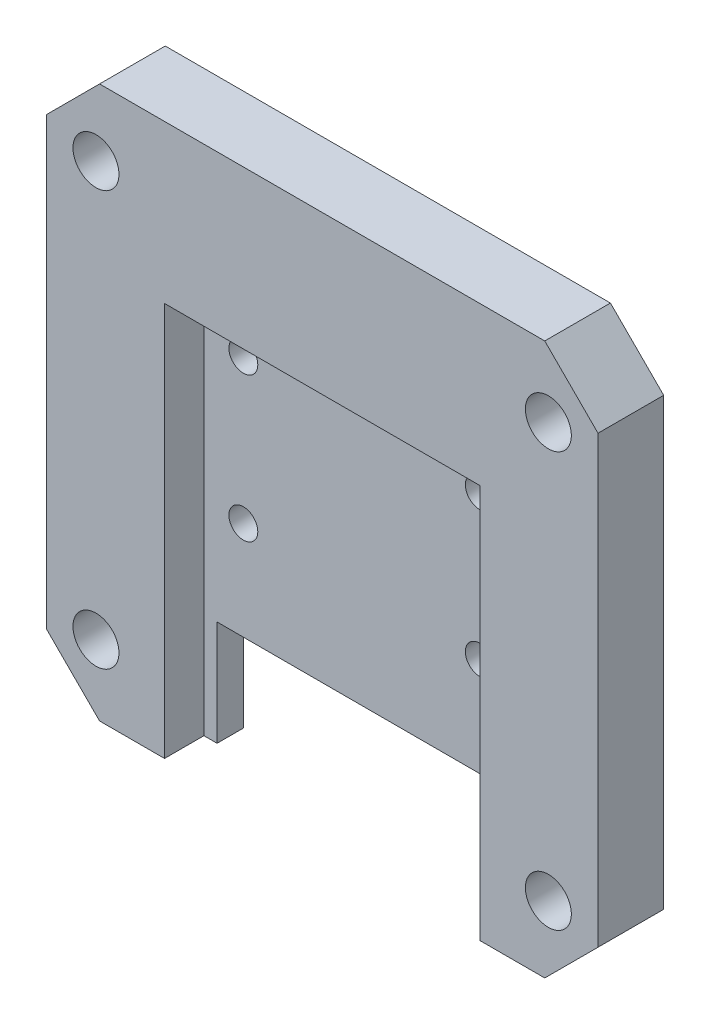
ISO-10303-21;
HEADER;
FILE_DESCRIPTION(('STEP AP214'),'2;1');
FILE_NAME('part.step','',(''),(''),'','','');
FILE_SCHEMA(('AUTOMOTIVE_DESIGN { 1 0 10303 214 1 1 1 1 }'));
ENDSEC;
DATA;
#1=APPLICATION_CONTEXT('core data for automotive mechanical design processes');
#2=APPLICATION_PROTOCOL_DEFINITION('international standard','automotive_design',2000,#1);
#3=PRODUCT_CONTEXT('',#1,'mechanical');
#4=PRODUCT('Part','Part','',(#3));
#5=PRODUCT_RELATED_PRODUCT_CATEGORY('part','',(#4));
#6=PRODUCT_DEFINITION_FORMATION('','',#4);
#7=PRODUCT_DEFINITION_CONTEXT('part definition',#1,'design');
#8=PRODUCT_DEFINITION('design','',#6,#7);
#9=PRODUCT_DEFINITION_SHAPE('','',#8);
#10=(LENGTH_UNIT() NAMED_UNIT(*) SI_UNIT(.MILLI.,.METRE.));
#11=(NAMED_UNIT(*) PLANE_ANGLE_UNIT() SI_UNIT($,.RADIAN.));
#12=(NAMED_UNIT(*) SI_UNIT($,.STERADIAN.) SOLID_ANGLE_UNIT());
#13=UNCERTAINTY_MEASURE_WITH_UNIT(LENGTH_MEASURE(1.E-05),#10,'distance_accuracy_value','');
#14=(GEOMETRIC_REPRESENTATION_CONTEXT(3) GLOBAL_UNCERTAINTY_ASSIGNED_CONTEXT((#13)) GLOBAL_UNIT_ASSIGNED_CONTEXT((#10,
#11,#12)) REPRESENTATION_CONTEXT('',''));
#15=CARTESIAN_POINT('',(0.,0.,0.));
#16=DIRECTION('',(0.,0.,1.));
#17=DIRECTION('',(1.,0.,0.));
#18=AXIS2_PLACEMENT_3D('',#15,#16,#17);
#19=CARTESIAN_POINT('',(4.05500000000004,0.,5.));
#20=DIRECTION('',(0.,1.,0.));
#21=DIRECTION('',(-1.,0.,0.));
#22=AXIS2_PLACEMENT_3D('',#19,#20,#21);
#23=PLANE('',#22);
#24=DIRECTION('',(1.,0.,0.));
#25=VECTOR('',#24,1.);
#26=CARTESIAN_POINT('',(8.99999999999999,0.,2.));
#27=LINE('',#26,#25);
#28=CARTESIAN_POINT('',(8.99999999999999,0.,2.));
#29=VERTEX_POINT('',#28);
#30=CARTESIAN_POINT('',(9.99999999999999,0.,2.));
#31=VERTEX_POINT('',#30);
#32=EDGE_CURVE('E166',#29,#31,#27,.T.);
#33=ORIENTED_EDGE('',*,*,#32,.F.);
#34=DIRECTION('',(0.,0.,1.));
#35=VECTOR('',#34,1.);
#36=CARTESIAN_POINT('',(8.99999999999999,0.,2.));
#37=LINE('',#36,#35);
#38=CARTESIAN_POINT('',(8.99999999999999,0.,5.));
#39=VERTEX_POINT('',#38);
#40=EDGE_CURVE('E152',#29,#39,#37,.T.);
#41=ORIENTED_EDGE('',*,*,#40,.T.);
#42=DIRECTION('',(1.,0.,0.));
#43=VECTOR('',#42,1.);
#44=CARTESIAN_POINT('',(4.05500000000004,0.,5.));
#45=LINE('',#44,#43);
#46=CARTESIAN_POINT('',(4.05500000000004,0.,5.));
#47=VERTEX_POINT('',#46);
#48=EDGE_CURVE('E252',#47,#39,#45,.T.);
#49=ORIENTED_EDGE('',*,*,#48,.F.);
#50=DIRECTION('',(0.,0.,-1.));
#51=VECTOR('',#50,1.);
#52=CARTESIAN_POINT('',(4.05500000000004,0.,5.));
#53=LINE('',#52,#51);
#54=CARTESIAN_POINT('',(4.05500000000004,0.,0.));
#55=VERTEX_POINT('',#54);
#56=EDGE_CURVE('E286',#47,#55,#53,.T.);
#57=ORIENTED_EDGE('',*,*,#56,.T.);
#58=DIRECTION('',(1.,0.,0.));
#59=VECTOR('',#58,1.);
#60=CARTESIAN_POINT('',(4.05500000000004,0.,0.));
#61=LINE('',#60,#59);
#62=CARTESIAN_POINT('',(9.99999999999999,0.,0.));
#63=VERTEX_POINT('',#62);
#64=EDGE_CURVE('E269',#55,#63,#61,.T.);
#65=ORIENTED_EDGE('',*,*,#64,.T.);
#66=DIRECTION('',(0.,0.,1.));
#67=VECTOR('',#66,1.);
#68=CARTESIAN_POINT('',(9.99999999999999,0.,0.));
#69=LINE('',#68,#67);
#70=EDGE_CURVE('E176',#63,#31,#69,.T.);
#71=ORIENTED_EDGE('',*,*,#70,.T.);
#72=EDGE_LOOP('',(#33,#41,#49,#57,#65,#71));
#73=FACE_BOUND('',#72,.T.);
#74=ADVANCED_FACE('F41',(#73),#23,.F.);
#75=CARTESIAN_POINT('',(0.,0.,5.));
#76=DIRECTION('',(0.,0.,1.));
#77=DIRECTION('',(1.,0.,0.));
#78=AXIS2_PLACEMENT_3D('',#75,#76,#77);
#79=PLANE('',#78);
#80=DIRECTION('',(0.,-1.,0.));
#81=VECTOR('',#80,1.);
#82=CARTESIAN_POINT('',(8.99999999999999,0.,5.));
#83=LINE('',#82,#81);
#84=CARTESIAN_POINT('',(8.99999999999999,30.,5.));
#85=VERTEX_POINT('',#84);
#86=EDGE_CURVE('E159',#85,#39,#83,.T.);
#87=ORIENTED_EDGE('',*,*,#86,.F.);
#88=DIRECTION('',(-1.,0.,0.));
#89=VECTOR('',#88,1.);
#90=CARTESIAN_POINT('',(8.99999999999999,30.,5.));
#91=LINE('',#90,#89);
#92=CARTESIAN_POINT('',(33.,30.,5.));
#93=VERTEX_POINT('',#92);
#94=EDGE_CURVE('E174',#93,#85,#91,.T.);
#95=ORIENTED_EDGE('',*,*,#94,.F.);
#96=DIRECTION('',(0.,1.,0.));
#97=VECTOR('',#96,1.);
#98=CARTESIAN_POINT('',(33.,0.,5.));
#99=LINE('',#98,#97);
#100=CARTESIAN_POINT('',(33.,0.,5.));
#101=VERTEX_POINT('',#100);
#102=EDGE_CURVE('E188',#101,#93,#99,.T.);
#103=ORIENTED_EDGE('',*,*,#102,.F.);
#104=CARTESIAN_POINT('',(37.9449999999997,0.,5.));
#105=VERTEX_POINT('',#104);
#106=EDGE_CURVE('E253',#101,#105,#45,.T.);
#107=ORIENTED_EDGE('',*,*,#106,.T.);
#108=DIRECTION('',(0.707106781186596,0.707106781186499,0.));
#109=VECTOR('',#108,1.);
#110=CARTESIAN_POINT('',(42.,4.05499999999975,5.));
#111=LINE('',#110,#109);
#112=CARTESIAN_POINT('',(42.,4.05499999999975,5.));
#113=VERTEX_POINT('',#112);
#114=EDGE_CURVE('E255',#105,#113,#111,.T.);
#115=ORIENTED_EDGE('',*,*,#114,.T.);
#116=DIRECTION('',(0.,1.,0.));
#117=VECTOR('',#116,1.);
#118=CARTESIAN_POINT('',(42.,4.05499999999975,5.));
#119=LINE('',#118,#117);
#120=CARTESIAN_POINT('',(42.,37.9449999999999,5.));
#121=VERTEX_POINT('',#120);
#122=EDGE_CURVE('E258',#113,#121,#119,.T.);
#123=ORIENTED_EDGE('',*,*,#122,.T.);
#124=DIRECTION('',(-0.707106781186536,0.707106781186559,0.));
#125=VECTOR('',#124,1.);
#126=CARTESIAN_POINT('',(37.945,42.,5.));
#127=LINE('',#126,#125);
#128=CARTESIAN_POINT('',(37.945,42.,5.));
#129=VERTEX_POINT('',#128);
#130=EDGE_CURVE('E256',#121,#129,#127,.T.);
#131=ORIENTED_EDGE('',*,*,#130,.T.);
#132=DIRECTION('',(-1.,0.,0.));
#133=VECTOR('',#132,1.);
#134=CARTESIAN_POINT('',(4.05500000000001,42.,5.));
#135=LINE('',#134,#133);
#136=CARTESIAN_POINT('',(4.05500000000001,42.,5.));
#137=VERTEX_POINT('',#136);
#138=EDGE_CURVE('E243',#129,#137,#135,.T.);
#139=ORIENTED_EDGE('',*,*,#138,.T.);
#140=DIRECTION('',(-0.707106781186525,-0.70710678118657,0.));
#141=VECTOR('',#140,1.);
#142=CARTESIAN_POINT('',(4.05500000000001,42.,5.));
#143=LINE('',#142,#141);
#144=CARTESIAN_POINT('',(0.,37.9449999999997,5.));
#145=VERTEX_POINT('',#144);
#146=EDGE_CURVE('E244',#137,#145,#143,.T.);
#147=ORIENTED_EDGE('',*,*,#146,.T.);
#148=DIRECTION('',(0.,-1.,0.));
#149=VECTOR('',#148,1.);
#150=CARTESIAN_POINT('',(0.,4.05499999999973,5.));
#151=LINE('',#150,#149);
#152=CARTESIAN_POINT('',(0.,4.05499999999973,5.));
#153=VERTEX_POINT('',#152);
#154=EDGE_CURVE('E250',#145,#153,#151,.T.);
#155=ORIENTED_EDGE('',*,*,#154,.T.);
#156=DIRECTION('',(0.707106781186574,-0.707106781186521,0.));
#157=VECTOR('',#156,1.);
#158=CARTESIAN_POINT('',(0.,4.05499999999973,5.));
#159=LINE('',#158,#157);
#160=EDGE_CURVE('E247',#153,#47,#159,.T.);
#161=ORIENTED_EDGE('',*,*,#160,.T.);
#162=ORIENTED_EDGE('',*,*,#48,.T.);
#163=EDGE_LOOP('',(#87,#95,#103,#107,#115,#123,#131,#139,#147,#155,#161,#162));
#164=FACE_BOUND('',#163,.T.);
#165=CARTESIAN_POINT('',(38.2202525316936,5.22499999999948,5.));
#166=DIRECTION('',(0.,0.,1.));
#167=DIRECTION('',(-1.,0.,0.));
#168=AXIS2_PLACEMENT_3D('',#165,#166,#167);
#169=CIRCLE('',#168,1.75);
#170=CARTESIAN_POINT('',(36.4702525316936,5.22499999999948,5.));
#171=VERTEX_POINT('',#170);
#172=EDGE_CURVE('E224',#171,#171,#169,.T.);
#173=ORIENTED_EDGE('',*,*,#172,.F.);
#174=EDGE_LOOP('',(#173));
#175=FACE_BOUND('',#174,.T.);
#176=CARTESIAN_POINT('',(3.77974746830582,5.22499999999973,5.));
#177=DIRECTION('',(0.,0.,1.));
#178=DIRECTION('',(1.,0.,0.));
#179=AXIS2_PLACEMENT_3D('',#176,#177,#178);
#180=CIRCLE('',#179,1.75);
#181=CARTESIAN_POINT('',(5.52974746830581,5.22499999999973,5.));
#182=VERTEX_POINT('',#181);
#183=EDGE_CURVE('E234',#182,#182,#180,.T.);
#184=ORIENTED_EDGE('',*,*,#183,.F.);
#185=EDGE_LOOP('',(#184));
#186=FACE_BOUND('',#185,.T.);
#187=CARTESIAN_POINT('',(3.77974746830579,36.7749999999997,5.));
#188=DIRECTION('',(0.,0.,1.));
#189=DIRECTION('',(1.,0.,0.));
#190=AXIS2_PLACEMENT_3D('',#187,#188,#189);
#191=CIRCLE('',#190,1.75);
#192=CARTESIAN_POINT('',(5.52974746830579,36.7749999999997,5.));
#193=VERTEX_POINT('',#192);
#194=EDGE_CURVE('E229',#193,#193,#191,.T.);
#195=ORIENTED_EDGE('',*,*,#194,.F.);
#196=EDGE_LOOP('',(#195));
#197=FACE_BOUND('',#196,.T.);
#198=CARTESIAN_POINT('',(38.2202525316942,36.7749999999995,5.));
#199=DIRECTION('',(0.,0.,1.));
#200=DIRECTION('',(-1.,0.,0.));
#201=AXIS2_PLACEMENT_3D('',#198,#199,#200);
#202=CIRCLE('',#201,1.75);
#203=CARTESIAN_POINT('',(36.4702525316942,36.7749999999995,5.));
#204=VERTEX_POINT('',#203);
#205=EDGE_CURVE('E220',#204,#204,#202,.T.);
#206=ORIENTED_EDGE('',*,*,#205,.F.);
#207=EDGE_LOOP('',(#206));
#208=FACE_BOUND('',#207,.T.);
#209=ADVANCED_FACE('F325',(#164,#175,#186,#197,#208),#79,.T.);
#210=CARTESIAN_POINT('',(0.,0.,0.));
#211=DIRECTION('',(0.,0.,1.));
#212=DIRECTION('',(1.,0.,0.));
#213=AXIS2_PLACEMENT_3D('',#210,#211,#212);
#214=PLANE('',#213);
#215=CARTESIAN_POINT('',(30.,26.5,0.));
#216=DIRECTION('',(0.,0.,1.));
#217=DIRECTION('',(1.,0.,0.));
#218=AXIS2_PLACEMENT_3D('',#215,#216,#217);
#219=CIRCLE('',#218,1.1);
#220=CARTESIAN_POINT('',(31.1,26.5,0.));
#221=VERTEX_POINT('',#220);
#222=EDGE_CURVE('E190',#221,#221,#219,.T.);
#223=ORIENTED_EDGE('',*,*,#222,.T.);
#224=EDGE_LOOP('',(#223));
#225=FACE_BOUND('',#224,.T.);
#226=CARTESIAN_POINT('',(12.,15.5,0.));
#227=DIRECTION('',(0.,0.,1.));
#228=DIRECTION('',(1.,0.,0.));
#229=AXIS2_PLACEMENT_3D('',#226,#227,#228);
#230=CIRCLE('',#229,1.1);
#231=CARTESIAN_POINT('',(13.1,15.5,0.));
#232=VERTEX_POINT('',#231);
#233=EDGE_CURVE('E543',#232,#232,#230,.T.);
#234=ORIENTED_EDGE('',*,*,#233,.T.);
#235=EDGE_LOOP('',(#234));
#236=FACE_BOUND('',#235,.T.);
#237=CARTESIAN_POINT('',(30.,15.5,0.));
#238=DIRECTION('',(0.,0.,1.));
#239=DIRECTION('',(1.,0.,0.));
#240=AXIS2_PLACEMENT_3D('',#237,#238,#239);
#241=CIRCLE('',#240,1.1);
#242=CARTESIAN_POINT('',(31.1,15.5,0.));
#243=VERTEX_POINT('',#242);
#244=EDGE_CURVE('E544',#243,#243,#241,.T.);
#245=ORIENTED_EDGE('',*,*,#244,.T.);
#246=EDGE_LOOP('',(#245));
#247=FACE_BOUND('',#246,.T.);
#248=CARTESIAN_POINT('',(12.,26.5,0.));
#249=DIRECTION('',(0.,0.,1.));
#250=DIRECTION('',(1.,0.,0.));
#251=AXIS2_PLACEMENT_3D('',#248,#249,#250);
#252=CIRCLE('',#251,1.1);
#253=CARTESIAN_POINT('',(13.1,26.5,0.));
#254=VERTEX_POINT('',#253);
#255=EDGE_CURVE('E549',#254,#254,#252,.T.);
#256=ORIENTED_EDGE('',*,*,#255,.T.);
#257=EDGE_LOOP('',(#256));
#258=FACE_BOUND('',#257,.T.);
#259=DIRECTION('',(-1.,0.,0.));
#260=VECTOR('',#259,1.);
#261=CARTESIAN_POINT('',(9.99999999999999,7.99999999999999,0.));
#262=LINE('',#261,#260);
#263=CARTESIAN_POINT('',(32.,7.99999999999999,0.));
#264=VERTEX_POINT('',#263);
#265=CARTESIAN_POINT('',(9.99999999999999,7.99999999999999,0.));
#266=VERTEX_POINT('',#265);
#267=EDGE_CURVE('E204',#264,#266,#262,.T.);
#268=ORIENTED_EDGE('',*,*,#267,.T.);
#269=DIRECTION('',(0.,-1.,0.));
#270=VECTOR('',#269,1.);
#271=CARTESIAN_POINT('',(9.99999999999999,7.99999999999999,0.));
#272=LINE('',#271,#270);
#273=EDGE_CURVE('E199',#266,#63,#272,.T.);
#274=ORIENTED_EDGE('',*,*,#273,.T.);
#275=ORIENTED_EDGE('',*,*,#64,.F.);
#276=DIRECTION('',(0.707106781186574,-0.707106781186521,0.));
#277=VECTOR('',#276,1.);
#278=CARTESIAN_POINT('',(0.,4.05499999999973,0.));
#279=LINE('',#278,#277);
#280=CARTESIAN_POINT('',(0.,4.05499999999973,0.));
#281=VERTEX_POINT('',#280);
#282=EDGE_CURVE('E270',#281,#55,#279,.T.);
#283=ORIENTED_EDGE('',*,*,#282,.F.);
#284=DIRECTION('',(0.,-1.,0.));
#285=VECTOR('',#284,1.);
#286=CARTESIAN_POINT('',(0.,4.05499999999973,0.));
#287=LINE('',#286,#285);
#288=CARTESIAN_POINT('',(0.,37.9449999999997,0.));
#289=VERTEX_POINT('',#288);
#290=EDGE_CURVE('E264',#289,#281,#287,.T.);
#291=ORIENTED_EDGE('',*,*,#290,.F.);
#292=DIRECTION('',(-0.707106781186525,-0.70710678118657,0.));
#293=VECTOR('',#292,1.);
#294=CARTESIAN_POINT('',(4.05500000000001,42.,0.));
#295=LINE('',#294,#293);
#296=CARTESIAN_POINT('',(4.05500000000001,42.,0.));
#297=VERTEX_POINT('',#296);
#298=EDGE_CURVE('E263',#297,#289,#295,.T.);
#299=ORIENTED_EDGE('',*,*,#298,.F.);
#300=DIRECTION('',(-1.,0.,0.));
#301=VECTOR('',#300,1.);
#302=CARTESIAN_POINT('',(4.05500000000001,42.,0.));
#303=LINE('',#302,#301);
#304=CARTESIAN_POINT('',(37.945,42.,0.));
#305=VERTEX_POINT('',#304);
#306=EDGE_CURVE('E236',#305,#297,#303,.T.);
#307=ORIENTED_EDGE('',*,*,#306,.F.);
#308=DIRECTION('',(-0.707106781186536,0.707106781186559,0.));
#309=VECTOR('',#308,1.);
#310=CARTESIAN_POINT('',(37.945,42.,0.));
#311=LINE('',#310,#309);
#312=CARTESIAN_POINT('',(42.,37.9449999999999,0.));
#313=VERTEX_POINT('',#312);
#314=EDGE_CURVE('E242',#313,#305,#311,.T.);
#315=ORIENTED_EDGE('',*,*,#314,.F.);
#316=DIRECTION('',(0.,1.,0.));
#317=VECTOR('',#316,1.);
#318=CARTESIAN_POINT('',(42.,4.05499999999975,0.));
#319=LINE('',#318,#317);
#320=CARTESIAN_POINT('',(42.,4.05499999999975,0.));
#321=VERTEX_POINT('',#320);
#322=EDGE_CURVE('E273',#321,#313,#319,.T.);
#323=ORIENTED_EDGE('',*,*,#322,.F.);
#324=DIRECTION('',(0.707106781186596,0.707106781186499,0.));
#325=VECTOR('',#324,1.);
#326=CARTESIAN_POINT('',(42.,4.05499999999975,0.));
#327=LINE('',#326,#325);
#328=CARTESIAN_POINT('',(37.9449999999997,0.,0.));
#329=VERTEX_POINT('',#328);
#330=EDGE_CURVE('E275',#329,#321,#327,.T.);
#331=ORIENTED_EDGE('',*,*,#330,.F.);
#332=CARTESIAN_POINT('',(32.,0.,0.));
#333=VERTEX_POINT('',#332);
#334=EDGE_CURVE('E267',#333,#329,#61,.T.);
#335=ORIENTED_EDGE('',*,*,#334,.F.);
#336=DIRECTION('',(0.,1.,0.));
#337=VECTOR('',#336,1.);
#338=CARTESIAN_POINT('',(32.,7.99999999999999,0.));
#339=LINE('',#338,#337);
#340=EDGE_CURVE('E61',#333,#264,#339,.T.);
#341=ORIENTED_EDGE('',*,*,#340,.T.);
#342=EDGE_LOOP('',(#268,#274,#275,#283,#291,#299,#307,#315,#323,#331,#335,#341));
#343=FACE_BOUND('',#342,.T.);
#344=CARTESIAN_POINT('',(3.77974746830582,5.22499999999973,0.));
#345=DIRECTION('',(0.,0.,1.));
#346=DIRECTION('',(1.,0.,0.));
#347=AXIS2_PLACEMENT_3D('',#344,#345,#346);
#348=CIRCLE('',#347,1.75);
#349=CARTESIAN_POINT('',(5.52974746830581,5.22499999999973,0.));
#350=VERTEX_POINT('',#349);
#351=EDGE_CURVE('E235',#350,#350,#348,.T.);
#352=ORIENTED_EDGE('',*,*,#351,.T.);
#353=EDGE_LOOP('',(#352));
#354=FACE_BOUND('',#353,.T.);
#355=CARTESIAN_POINT('',(3.77974746830579,36.7749999999997,0.));
#356=DIRECTION('',(0.,0.,1.));
#357=DIRECTION('',(1.,0.,0.));
#358=AXIS2_PLACEMENT_3D('',#355,#356,#357);
#359=CIRCLE('',#358,1.75);
#360=CARTESIAN_POINT('',(5.52974746830579,36.7749999999997,0.));
#361=VERTEX_POINT('',#360);
#362=EDGE_CURVE('E228',#361,#361,#359,.T.);
#363=ORIENTED_EDGE('',*,*,#362,.T.);
#364=EDGE_LOOP('',(#363));
#365=FACE_BOUND('',#364,.T.);
#366=CARTESIAN_POINT('',(38.2202525316936,5.22499999999948,0.));
#367=DIRECTION('',(0.,0.,1.));
#368=DIRECTION('',(-1.,0.,0.));
#369=AXIS2_PLACEMENT_3D('',#366,#367,#368);
#370=CIRCLE('',#369,1.75);
#371=CARTESIAN_POINT('',(36.4702525316936,5.22499999999948,0.));
#372=VERTEX_POINT('',#371);
#373=EDGE_CURVE('E219',#372,#372,#370,.T.);
#374=ORIENTED_EDGE('',*,*,#373,.T.);
#375=EDGE_LOOP('',(#374));
#376=FACE_BOUND('',#375,.T.);
#377=CARTESIAN_POINT('',(38.2202525316942,36.7749999999995,0.));
#378=DIRECTION('',(0.,0.,1.));
#379=DIRECTION('',(-1.,0.,0.));
#380=AXIS2_PLACEMENT_3D('',#377,#378,#379);
#381=CIRCLE('',#380,1.75);
#382=CARTESIAN_POINT('',(36.4702525316942,36.7749999999995,0.));
#383=VERTEX_POINT('',#382);
#384=EDGE_CURVE('E209',#383,#383,#381,.T.);
#385=ORIENTED_EDGE('',*,*,#384,.T.);
#386=EDGE_LOOP('',(#385));
#387=FACE_BOUND('',#386,.T.);
#388=ADVANCED_FACE('F307',(#225,#236,#247,#258,#343,#354,#365,#376,#387),#214,.F.);
#389=CARTESIAN_POINT('',(4.05500000000001,42.,5.));
#390=DIRECTION('',(0.,-1.,0.));
#391=DIRECTION('',(1.,0.,0.));
#392=AXIS2_PLACEMENT_3D('',#389,#390,#391);
#393=PLANE('',#392);
#394=ORIENTED_EDGE('',*,*,#306,.T.);
#395=DIRECTION('',(0.,0.,-1.));
#396=VECTOR('',#395,1.);
#397=CARTESIAN_POINT('',(4.05500000000001,42.,5.));
#398=LINE('',#397,#396);
#399=EDGE_CURVE('E47',#137,#297,#398,.T.);
#400=ORIENTED_EDGE('',*,*,#399,.F.);
#401=ORIENTED_EDGE('',*,*,#138,.F.);
#402=DIRECTION('',(0.,0.,-1.));
#403=VECTOR('',#402,1.);
#404=CARTESIAN_POINT('',(37.945,42.,5.));
#405=LINE('',#404,#403);
#406=EDGE_CURVE('E257',#129,#305,#405,.T.);
#407=ORIENTED_EDGE('',*,*,#406,.T.);
#408=EDGE_LOOP('',(#394,#400,#401,#407));
#409=FACE_BOUND('',#408,.T.);
#410=ADVANCED_FACE('F43',(#409),#393,.F.);
#411=CARTESIAN_POINT('',(4.05500000000001,42.,5.));
#412=DIRECTION('',(0.70710678118657,-0.707106781186525,0.));
#413=DIRECTION('',(0.707106781186525,0.70710678118657,0.));
#414=AXIS2_PLACEMENT_3D('',#411,#412,#413);
#415=PLANE('',#414);
#416=ORIENTED_EDGE('',*,*,#298,.T.);
#417=DIRECTION('',(0.,0.,-1.));
#418=VECTOR('',#417,1.);
#419=CARTESIAN_POINT('',(0.,37.9449999999997,5.));
#420=LINE('',#419,#418);
#421=EDGE_CURVE('E294',#145,#289,#420,.T.);
#422=ORIENTED_EDGE('',*,*,#421,.F.);
#423=ORIENTED_EDGE('',*,*,#146,.F.);
#424=ORIENTED_EDGE('',*,*,#399,.T.);
#425=EDGE_LOOP('',(#416,#422,#423,#424));
#426=FACE_BOUND('',#425,.T.);
#427=ADVANCED_FACE('F299',(#426),#415,.F.);
#428=CARTESIAN_POINT('',(0.,4.05499999999973,5.));
#429=DIRECTION('',(1.,0.,0.));
#430=DIRECTION('',(0.,1.,0.));
#431=AXIS2_PLACEMENT_3D('',#428,#429,#430);
#432=PLANE('',#431);
#433=ORIENTED_EDGE('',*,*,#290,.T.);
#434=DIRECTION('',(0.,0.,-1.));
#435=VECTOR('',#434,1.);
#436=CARTESIAN_POINT('',(0.,4.05499999999973,5.));
#437=LINE('',#436,#435);
#438=EDGE_CURVE('E292',#153,#281,#437,.T.);
#439=ORIENTED_EDGE('',*,*,#438,.F.);
#440=ORIENTED_EDGE('',*,*,#154,.F.);
#441=ORIENTED_EDGE('',*,*,#421,.T.);
#442=EDGE_LOOP('',(#433,#439,#440,#441));
#443=FACE_BOUND('',#442,.T.);
#444=ADVANCED_FACE('F312',(#443),#432,.F.);
#445=CARTESIAN_POINT('',(0.,4.05499999999973,5.));
#446=DIRECTION('',(0.707106781186521,0.707106781186574,0.));
#447=DIRECTION('',(-0.707106781186574,0.707106781186521,0.));
#448=AXIS2_PLACEMENT_3D('',#445,#446,#447);
#449=PLANE('',#448);
#450=ORIENTED_EDGE('',*,*,#282,.T.);
#451=ORIENTED_EDGE('',*,*,#56,.F.);
#452=ORIENTED_EDGE('',*,*,#160,.F.);
#453=ORIENTED_EDGE('',*,*,#438,.T.);
#454=EDGE_LOOP('',(#450,#451,#452,#453));
#455=FACE_BOUND('',#454,.T.);
#456=ADVANCED_FACE('F317',(#455),#449,.F.);
#457=ORIENTED_EDGE('',*,*,#106,.F.);
#458=DIRECTION('',(0.,0.,1.));
#459=VECTOR('',#458,1.);
#460=CARTESIAN_POINT('',(33.,0.,2.));
#461=LINE('',#460,#459);
#462=CARTESIAN_POINT('',(33.,0.,2.));
#463=VERTEX_POINT('',#462);
#464=EDGE_CURVE('E164',#463,#101,#461,.T.);
#465=ORIENTED_EDGE('',*,*,#464,.F.);
#466=CARTESIAN_POINT('',(32.,0.,2.));
#467=VERTEX_POINT('',#466);
#468=EDGE_CURVE('E171',#467,#463,#27,.T.);
#469=ORIENTED_EDGE('',*,*,#468,.F.);
#470=DIRECTION('',(0.,0.,1.));
#471=VECTOR('',#470,1.);
#472=CARTESIAN_POINT('',(32.,0.,0.));
#473=LINE('',#472,#471);
#474=EDGE_CURVE('E212',#333,#467,#473,.T.);
#475=ORIENTED_EDGE('',*,*,#474,.F.);
#476=ORIENTED_EDGE('',*,*,#334,.T.);
#477=DIRECTION('',(0.,0.,-1.));
#478=VECTOR('',#477,1.);
#479=CARTESIAN_POINT('',(37.9449999999997,0.,5.));
#480=LINE('',#479,#478);
#481=EDGE_CURVE('E282',#105,#329,#480,.T.);
#482=ORIENTED_EDGE('',*,*,#481,.F.);
#483=EDGE_LOOP('',(#457,#465,#469,#475,#476,#482));
#484=FACE_BOUND('',#483,.T.);
#485=ADVANCED_FACE('F337',(#484),#23,.F.);
#486=CARTESIAN_POINT('',(42.,4.05499999999975,5.));
#487=DIRECTION('',(-0.707106781186499,0.707106781186596,0.));
#488=DIRECTION('',(-0.707106781186596,-0.707106781186499,0.));
#489=AXIS2_PLACEMENT_3D('',#486,#487,#488);
#490=PLANE('',#489);
#491=ORIENTED_EDGE('',*,*,#330,.T.);
#492=DIRECTION('',(0.,0.,-1.));
#493=VECTOR('',#492,1.);
#494=CARTESIAN_POINT('',(42.,4.05499999999975,5.));
#495=LINE('',#494,#493);
#496=EDGE_CURVE('E285',#113,#321,#495,.T.);
#497=ORIENTED_EDGE('',*,*,#496,.F.);
#498=ORIENTED_EDGE('',*,*,#114,.F.);
#499=ORIENTED_EDGE('',*,*,#481,.T.);
#500=EDGE_LOOP('',(#491,#497,#498,#499));
#501=FACE_BOUND('',#500,.T.);
#502=ADVANCED_FACE('F333',(#501),#490,.F.);
#503=CARTESIAN_POINT('',(42.,4.05499999999975,5.));
#504=DIRECTION('',(-1.,0.,0.));
#505=DIRECTION('',(0.,-1.,0.));
#506=AXIS2_PLACEMENT_3D('',#503,#504,#505);
#507=PLANE('',#506);
#508=ORIENTED_EDGE('',*,*,#322,.T.);
#509=DIRECTION('',(0.,0.,-1.));
#510=VECTOR('',#509,1.);
#511=CARTESIAN_POINT('',(42.,37.9449999999999,5.));
#512=LINE('',#511,#510);
#513=EDGE_CURVE('E276',#121,#313,#512,.T.);
#514=ORIENTED_EDGE('',*,*,#513,.F.);
#515=ORIENTED_EDGE('',*,*,#122,.F.);
#516=ORIENTED_EDGE('',*,*,#496,.T.);
#517=EDGE_LOOP('',(#508,#514,#515,#516));
#518=FACE_BOUND('',#517,.T.);
#519=ADVANCED_FACE('F329',(#518),#507,.F.);
#520=CARTESIAN_POINT('',(37.945,42.,5.));
#521=DIRECTION('',(-0.707106781186559,-0.707106781186536,0.));
#522=DIRECTION('',(0.707106781186536,-0.707106781186559,0.));
#523=AXIS2_PLACEMENT_3D('',#520,#521,#522);
#524=PLANE('',#523);
#525=ORIENTED_EDGE('',*,*,#314,.T.);
#526=ORIENTED_EDGE('',*,*,#406,.F.);
#527=ORIENTED_EDGE('',*,*,#130,.F.);
#528=ORIENTED_EDGE('',*,*,#513,.T.);
#529=EDGE_LOOP('',(#525,#526,#527,#528));
#530=FACE_BOUND('',#529,.T.);
#531=ADVANCED_FACE('F327',(#530),#524,.F.);
#532=CARTESIAN_POINT('',(3.77974746830582,5.22499999999973,5.));
#533=DIRECTION('',(0.,0.,-1.));
#534=DIRECTION('',(-1.,0.,0.));
#535=AXIS2_PLACEMENT_3D('',#532,#533,#534);
#536=CYLINDRICAL_SURFACE('',#535,1.75);
#537=ORIENTED_EDGE('',*,*,#183,.T.);
#538=EDGE_LOOP('',(#537));
#539=FACE_BOUND('',#538,.T.);
#540=ORIENTED_EDGE('',*,*,#351,.F.);
#541=EDGE_LOOP('',(#540));
#542=FACE_BOUND('',#541,.T.);
#543=ADVANCED_FACE('F396',(#539,#542),#536,.F.);
#544=CARTESIAN_POINT('',(3.77974746830579,36.7749999999997,5.));
#545=DIRECTION('',(0.,0.,-1.));
#546=DIRECTION('',(-1.,0.,0.));
#547=AXIS2_PLACEMENT_3D('',#544,#545,#546);
#548=CYLINDRICAL_SURFACE('',#547,1.75);
#549=ORIENTED_EDGE('',*,*,#194,.T.);
#550=EDGE_LOOP('',(#549));
#551=FACE_BOUND('',#550,.T.);
#552=ORIENTED_EDGE('',*,*,#362,.F.);
#553=EDGE_LOOP('',(#552));
#554=FACE_BOUND('',#553,.T.);
#555=ADVANCED_FACE('F418',(#551,#554),#548,.F.);
#556=CARTESIAN_POINT('',(38.2202525316936,5.22499999999948,5.));
#557=DIRECTION('',(0.,0.,-1.));
#558=DIRECTION('',(-1.,0.,0.));
#559=AXIS2_PLACEMENT_3D('',#556,#557,#558);
#560=CYLINDRICAL_SURFACE('',#559,1.75);
#561=ORIENTED_EDGE('',*,*,#172,.T.);
#562=EDGE_LOOP('',(#561));
#563=FACE_BOUND('',#562,.T.);
#564=ORIENTED_EDGE('',*,*,#373,.F.);
#565=EDGE_LOOP('',(#564));
#566=FACE_BOUND('',#565,.T.);
#567=ADVANCED_FACE('F357',(#563,#566),#560,.F.);
#568=CARTESIAN_POINT('',(38.2202525316942,36.7749999999995,5.));
#569=DIRECTION('',(0.,0.,-1.));
#570=DIRECTION('',(-1.,0.,0.));
#571=AXIS2_PLACEMENT_3D('',#568,#569,#570);
#572=CYLINDRICAL_SURFACE('',#571,1.75);
#573=ORIENTED_EDGE('',*,*,#205,.T.);
#574=EDGE_LOOP('',(#573));
#575=FACE_BOUND('',#574,.T.);
#576=ORIENTED_EDGE('',*,*,#384,.F.);
#577=EDGE_LOOP('',(#576));
#578=FACE_BOUND('',#577,.T.);
#579=ADVANCED_FACE('F353',(#575,#578),#572,.F.);
#580=CARTESIAN_POINT('',(9.99999999999999,7.99999999999999,0.));
#581=DIRECTION('',(-1.,0.,0.));
#582=DIRECTION('',(0.,0.,1.));
#583=AXIS2_PLACEMENT_3D('',#580,#581,#582);
#584=PLANE('',#583);
#585=DIRECTION('',(0.,0.,1.));
#586=VECTOR('',#585,1.);
#587=CARTESIAN_POINT('',(9.99999999999999,7.99999999999999,0.));
#588=LINE('',#587,#586);
#589=CARTESIAN_POINT('',(9.99999999999999,7.99999999999999,2.));
#590=VERTEX_POINT('',#589);
#591=EDGE_CURVE('E210',#266,#590,#588,.T.);
#592=ORIENTED_EDGE('',*,*,#591,.T.);
#593=DIRECTION('',(0.,-1.,0.));
#594=VECTOR('',#593,1.);
#595=CARTESIAN_POINT('',(9.99999999999999,7.99999999999999,2.));
#596=LINE('',#595,#594);
#597=EDGE_CURVE('E196',#590,#31,#596,.T.);
#598=ORIENTED_EDGE('',*,*,#597,.T.);
#599=ORIENTED_EDGE('',*,*,#70,.F.);
#600=ORIENTED_EDGE('',*,*,#273,.F.);
#601=EDGE_LOOP('',(#592,#598,#599,#600));
#602=FACE_BOUND('',#601,.T.);
#603=ADVANCED_FACE('F349',(#602),#584,.F.);
#604=CARTESIAN_POINT('',(9.99999999999999,7.99999999999999,0.));
#605=DIRECTION('',(0.,1.,0.));
#606=DIRECTION('',(0.,0.,1.));
#607=AXIS2_PLACEMENT_3D('',#604,#605,#606);
#608=PLANE('',#607);
#609=DIRECTION('',(0.,0.,1.));
#610=VECTOR('',#609,1.);
#611=CARTESIAN_POINT('',(32.,7.99999999999999,0.));
#612=LINE('',#611,#610);
#613=CARTESIAN_POINT('',(32.,7.99999999999999,2.));
#614=VERTEX_POINT('',#613);
#615=EDGE_CURVE('E211',#264,#614,#612,.T.);
#616=ORIENTED_EDGE('',*,*,#615,.T.);
#617=DIRECTION('',(-1.,0.,0.));
#618=VECTOR('',#617,1.);
#619=CARTESIAN_POINT('',(9.99999999999999,7.99999999999999,2.));
#620=LINE('',#619,#618);
#621=EDGE_CURVE('E57',#614,#590,#620,.T.);
#622=ORIENTED_EDGE('',*,*,#621,.T.);
#623=ORIENTED_EDGE('',*,*,#591,.F.);
#624=ORIENTED_EDGE('',*,*,#267,.F.);
#625=EDGE_LOOP('',(#616,#622,#623,#624));
#626=FACE_BOUND('',#625,.T.);
#627=ADVANCED_FACE('F347',(#626),#608,.F.);
#628=CARTESIAN_POINT('',(32.,7.99999999999999,0.));
#629=DIRECTION('',(1.,0.,0.));
#630=DIRECTION('',(0.,0.,-1.));
#631=AXIS2_PLACEMENT_3D('',#628,#629,#630);
#632=PLANE('',#631);
#633=ORIENTED_EDGE('',*,*,#474,.T.);
#634=DIRECTION('',(0.,1.,0.));
#635=VECTOR('',#634,1.);
#636=CARTESIAN_POINT('',(32.,7.99999999999999,2.));
#637=LINE('',#636,#635);
#638=EDGE_CURVE('E11',#467,#614,#637,.T.);
#639=ORIENTED_EDGE('',*,*,#638,.T.);
#640=ORIENTED_EDGE('',*,*,#615,.F.);
#641=ORIENTED_EDGE('',*,*,#340,.F.);
#642=EDGE_LOOP('',(#633,#639,#640,#641));
#643=FACE_BOUND('',#642,.T.);
#644=ADVANCED_FACE('F341',(#643),#632,.F.);
#645=CARTESIAN_POINT('',(0.,0.,2.));
#646=DIRECTION('',(0.,0.,-1.));
#647=DIRECTION('',(-1.,0.,0.));
#648=AXIS2_PLACEMENT_3D('',#645,#646,#647);
#649=PLANE('',#648);
#650=CARTESIAN_POINT('',(30.,26.5,2.));
#651=DIRECTION('',(0.,0.,1.));
#652=DIRECTION('',(1.,0.,0.));
#653=AXIS2_PLACEMENT_3D('',#650,#651,#652);
#654=CIRCLE('',#653,1.1);
#655=CARTESIAN_POINT('',(31.1,26.5,2.));
#656=VERTEX_POINT('',#655);
#657=EDGE_CURVE('E541',#656,#656,#654,.T.);
#658=ORIENTED_EDGE('',*,*,#657,.F.);
#659=EDGE_LOOP('',(#658));
#660=FACE_BOUND('',#659,.T.);
#661=CARTESIAN_POINT('',(12.,15.5,2.));
#662=DIRECTION('',(0.,0.,1.));
#663=DIRECTION('',(1.,0.,0.));
#664=AXIS2_PLACEMENT_3D('',#661,#662,#663);
#665=CIRCLE('',#664,1.1);
#666=CARTESIAN_POINT('',(13.1,15.5,2.));
#667=VERTEX_POINT('',#666);
#668=EDGE_CURVE('E558',#667,#667,#665,.T.);
#669=ORIENTED_EDGE('',*,*,#668,.F.);
#670=EDGE_LOOP('',(#669));
#671=FACE_BOUND('',#670,.T.);
#672=CARTESIAN_POINT('',(30.,15.5,2.));
#673=DIRECTION('',(0.,0.,1.));
#674=DIRECTION('',(1.,0.,0.));
#675=AXIS2_PLACEMENT_3D('',#672,#673,#674);
#676=CIRCLE('',#675,1.1);
#677=CARTESIAN_POINT('',(31.1,15.5,2.));
#678=VERTEX_POINT('',#677);
#679=EDGE_CURVE('E559',#678,#678,#676,.T.);
#680=ORIENTED_EDGE('',*,*,#679,.F.);
#681=EDGE_LOOP('',(#680));
#682=FACE_BOUND('',#681,.T.);
#683=CARTESIAN_POINT('',(12.,26.5,2.));
#684=DIRECTION('',(0.,0.,1.));
#685=DIRECTION('',(1.,0.,0.));
#686=AXIS2_PLACEMENT_3D('',#683,#684,#685);
#687=CIRCLE('',#686,1.1);
#688=CARTESIAN_POINT('',(13.1,26.5,2.));
#689=VERTEX_POINT('',#688);
#690=EDGE_CURVE('E554',#689,#689,#687,.T.);
#691=ORIENTED_EDGE('',*,*,#690,.F.);
#692=EDGE_LOOP('',(#691));
#693=FACE_BOUND('',#692,.T.);
#694=ORIENTED_EDGE('',*,*,#621,.F.);
#695=ORIENTED_EDGE('',*,*,#638,.F.);
#696=ORIENTED_EDGE('',*,*,#468,.T.);
#697=DIRECTION('',(0.,1.,0.));
#698=VECTOR('',#697,1.);
#699=CARTESIAN_POINT('',(33.,0.,2.));
#700=LINE('',#699,#698);
#701=CARTESIAN_POINT('',(33.,30.,2.));
#702=VERTEX_POINT('',#701);
#703=EDGE_CURVE('E177',#463,#702,#700,.T.);
#704=ORIENTED_EDGE('',*,*,#703,.T.);
#705=DIRECTION('',(-1.,0.,0.));
#706=VECTOR('',#705,1.);
#707=CARTESIAN_POINT('',(8.99999999999999,30.,2.));
#708=LINE('',#707,#706);
#709=CARTESIAN_POINT('',(8.99999999999999,30.,2.));
#710=VERTEX_POINT('',#709);
#711=EDGE_CURVE('E167',#702,#710,#708,.T.);
#712=ORIENTED_EDGE('',*,*,#711,.T.);
#713=DIRECTION('',(0.,-1.,0.));
#714=VECTOR('',#713,1.);
#715=CARTESIAN_POINT('',(8.99999999999999,0.,2.));
#716=LINE('',#715,#714);
#717=EDGE_CURVE('E160',#710,#29,#716,.T.);
#718=ORIENTED_EDGE('',*,*,#717,.T.);
#719=ORIENTED_EDGE('',*,*,#32,.T.);
#720=ORIENTED_EDGE('',*,*,#597,.F.);
#721=EDGE_LOOP('',(#694,#695,#696,#704,#712,#718,#719,#720));
#722=FACE_BOUND('',#721,.T.);
#723=ADVANCED_FACE('F169',(#660,#671,#682,#693,#722),#649,.F.);
#724=CARTESIAN_POINT('',(8.99999999999999,0.,2.));
#725=DIRECTION('',(-1.,0.,0.));
#726=DIRECTION('',(0.,-1.,0.));
#727=AXIS2_PLACEMENT_3D('',#724,#725,#726);
#728=PLANE('',#727);
#729=ORIENTED_EDGE('',*,*,#86,.T.);
#730=ORIENTED_EDGE('',*,*,#40,.F.);
#731=ORIENTED_EDGE('',*,*,#717,.F.);
#732=DIRECTION('',(0.,0.,1.));
#733=VECTOR('',#732,1.);
#734=CARTESIAN_POINT('',(8.99999999999999,30.,2.));
#735=LINE('',#734,#733);
#736=EDGE_CURVE('E195',#710,#85,#735,.T.);
#737=ORIENTED_EDGE('',*,*,#736,.T.);
#738=EDGE_LOOP('',(#729,#730,#731,#737));
#739=FACE_BOUND('',#738,.T.);
#740=ADVANCED_FACE('F156',(#739),#728,.F.);
#741=CARTESIAN_POINT('',(8.99999999999999,30.,2.));
#742=DIRECTION('',(0.,1.,0.));
#743=DIRECTION('',(0.,0.,1.));
#744=AXIS2_PLACEMENT_3D('',#741,#742,#743);
#745=PLANE('',#744);
#746=ORIENTED_EDGE('',*,*,#94,.T.);
#747=ORIENTED_EDGE('',*,*,#736,.F.);
#748=ORIENTED_EDGE('',*,*,#711,.F.);
#749=DIRECTION('',(0.,0.,1.));
#750=VECTOR('',#749,1.);
#751=CARTESIAN_POINT('',(33.,30.,2.));
#752=LINE('',#751,#750);
#753=EDGE_CURVE('E192',#702,#93,#752,.T.);
#754=ORIENTED_EDGE('',*,*,#753,.T.);
#755=EDGE_LOOP('',(#746,#747,#748,#754));
#756=FACE_BOUND('',#755,.T.);
#757=ADVANCED_FACE('F476',(#756),#745,.F.);
#758=CARTESIAN_POINT('',(33.,0.,2.));
#759=DIRECTION('',(1.,0.,0.));
#760=DIRECTION('',(0.,0.,-1.));
#761=AXIS2_PLACEMENT_3D('',#758,#759,#760);
#762=PLANE('',#761);
#763=ORIENTED_EDGE('',*,*,#102,.T.);
#764=ORIENTED_EDGE('',*,*,#753,.F.);
#765=ORIENTED_EDGE('',*,*,#703,.F.);
#766=ORIENTED_EDGE('',*,*,#464,.T.);
#767=EDGE_LOOP('',(#763,#764,#765,#766));
#768=FACE_BOUND('',#767,.T.);
#769=ADVANCED_FACE('F490',(#768),#762,.F.);
#770=CARTESIAN_POINT('',(12.,26.5,-1.));
#771=DIRECTION('',(0.,0.,1.));
#772=DIRECTION('',(1.,0.,0.));
#773=AXIS2_PLACEMENT_3D('',#770,#771,#772);
#774=CYLINDRICAL_SURFACE('',#773,1.1);
#775=ORIENTED_EDGE('',*,*,#690,.T.);
#776=EDGE_LOOP('',(#775));
#777=FACE_BOUND('',#776,.T.);
#778=ORIENTED_EDGE('',*,*,#255,.F.);
#779=EDGE_LOOP('',(#778));
#780=FACE_BOUND('',#779,.T.);
#781=ADVANCED_FACE('F497',(#777,#780),#774,.F.);
#782=CARTESIAN_POINT('',(30.,15.5,-1.));
#783=DIRECTION('',(0.,0.,1.));
#784=DIRECTION('',(1.,0.,0.));
#785=AXIS2_PLACEMENT_3D('',#782,#783,#784);
#786=CYLINDRICAL_SURFACE('',#785,1.1);
#787=ORIENTED_EDGE('',*,*,#679,.T.);
#788=EDGE_LOOP('',(#787));
#789=FACE_BOUND('',#788,.T.);
#790=ORIENTED_EDGE('',*,*,#244,.F.);
#791=EDGE_LOOP('',(#790));
#792=FACE_BOUND('',#791,.T.);
#793=ADVANCED_FACE('F502',(#789,#792),#786,.F.);
#794=CARTESIAN_POINT('',(12.,15.5,-1.));
#795=DIRECTION('',(0.,0.,1.));
#796=DIRECTION('',(1.,0.,0.));
#797=AXIS2_PLACEMENT_3D('',#794,#795,#796);
#798=CYLINDRICAL_SURFACE('',#797,1.1);
#799=ORIENTED_EDGE('',*,*,#668,.T.);
#800=EDGE_LOOP('',(#799));
#801=FACE_BOUND('',#800,.T.);
#802=ORIENTED_EDGE('',*,*,#233,.F.);
#803=EDGE_LOOP('',(#802));
#804=FACE_BOUND('',#803,.T.);
#805=ADVANCED_FACE('F513',(#801,#804),#798,.F.);
#806=CARTESIAN_POINT('',(30.,26.5,-1.));
#807=DIRECTION('',(0.,0.,1.));
#808=DIRECTION('',(1.,0.,0.));
#809=AXIS2_PLACEMENT_3D('',#806,#807,#808);
#810=CYLINDRICAL_SURFACE('',#809,1.1);
#811=ORIENTED_EDGE('',*,*,#657,.T.);
#812=EDGE_LOOP('',(#811));
#813=FACE_BOUND('',#812,.T.);
#814=ORIENTED_EDGE('',*,*,#222,.F.);
#815=EDGE_LOOP('',(#814));
#816=FACE_BOUND('',#815,.T.);
#817=ADVANCED_FACE('F524',(#813,#816),#810,.F.);
#818=CLOSED_SHELL('',(#74,#209,#388,#410,#427,#444,#456,#485,#502,#519,#531,#543,#555,#567,#579,
#603,#627,#644,#723,#740,#757,#769,#781,#793,#805,#817));
#819=MANIFOLD_SOLID_BREP('B2',#818);
#820=ADVANCED_BREP_SHAPE_REPRESENTATION('',(#18,#819),#14);
#821=SHAPE_DEFINITION_REPRESENTATION(#9,#820);
ENDSEC;
END-ISO-10303-21;
